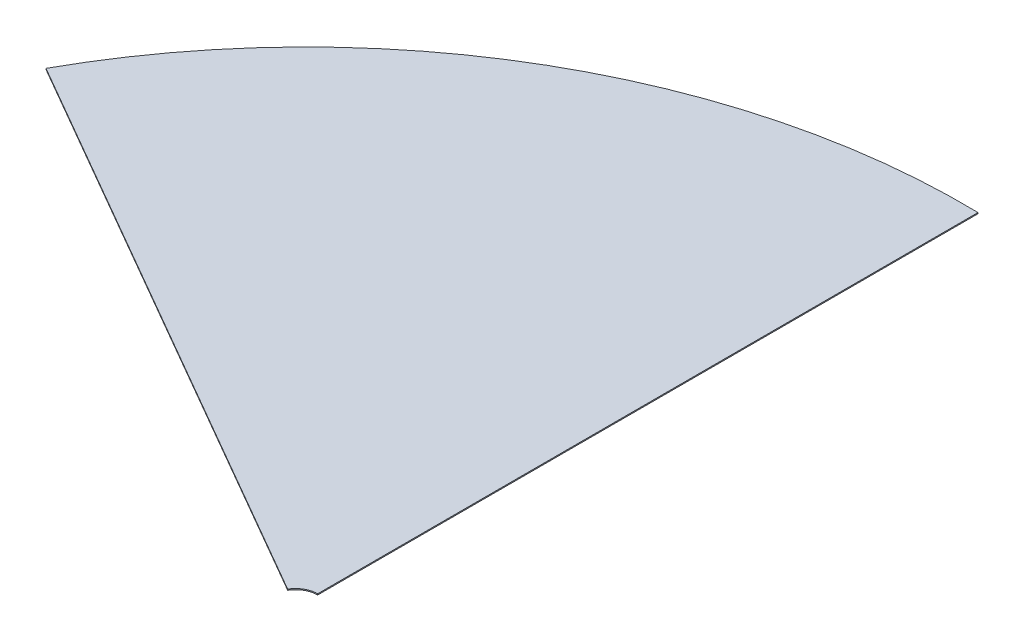
ISO-10303-21;
HEADER;
FILE_DESCRIPTION(('STEP AP214'),'2;1');
FILE_NAME('part.step','',(''),(''),'','','');
FILE_SCHEMA(('AUTOMOTIVE_DESIGN { 1 0 10303 214 1 1 1 1 }'));
ENDSEC;
DATA;
#1=APPLICATION_CONTEXT('core data for automotive mechanical design processes');
#2=APPLICATION_PROTOCOL_DEFINITION('international standard','automotive_design',2000,#1);
#3=PRODUCT_CONTEXT('',#1,'mechanical');
#4=PRODUCT('Part','Part','',(#3));
#5=PRODUCT_RELATED_PRODUCT_CATEGORY('part','',(#4));
#6=PRODUCT_DEFINITION_FORMATION('','',#4);
#7=PRODUCT_DEFINITION_CONTEXT('part definition',#1,'design');
#8=PRODUCT_DEFINITION('design','',#6,#7);
#9=PRODUCT_DEFINITION_SHAPE('','',#8);
#10=(LENGTH_UNIT() NAMED_UNIT(*) SI_UNIT(.MILLI.,.METRE.));
#11=(NAMED_UNIT(*) PLANE_ANGLE_UNIT() SI_UNIT($,.RADIAN.));
#12=(NAMED_UNIT(*) SI_UNIT($,.STERADIAN.) SOLID_ANGLE_UNIT());
#13=UNCERTAINTY_MEASURE_WITH_UNIT(LENGTH_MEASURE(1.E-05),#10,'distance_accuracy_value','');
#14=(GEOMETRIC_REPRESENTATION_CONTEXT(3) GLOBAL_UNCERTAINTY_ASSIGNED_CONTEXT((#13)) GLOBAL_UNIT_ASSIGNED_CONTEXT((#10,
#11,#12)) REPRESENTATION_CONTEXT('',''));
#15=CARTESIAN_POINT('',(0.,0.,0.));
#16=DIRECTION('',(0.,0.,1.));
#17=DIRECTION('',(1.,0.,0.));
#18=AXIS2_PLACEMENT_3D('',#15,#16,#17);
#19=CARTESIAN_POINT('',(0.,0.5,0.));
#20=DIRECTION('',(0.,-1.,0.));
#21=DIRECTION('',(0.,0.,-1.));
#22=AXIS2_PLACEMENT_3D('',#19,#20,#21);
#23=CYLINDRICAL_SURFACE('',#22,10.);
#24=CARTESIAN_POINT('',(0.,0.,0.));
#25=DIRECTION('',(0.,-1.,0.));
#26=DIRECTION('',(0.,0.,1.));
#27=AXIS2_PLACEMENT_3D('',#24,#25,#26);
#28=CIRCLE('',#27,10.);
#29=CARTESIAN_POINT('',(-8.6602540378444,0.,-4.99999999999998));
#30=VERTEX_POINT('',#29);
#31=CARTESIAN_POINT('',(0.,0.,-10.));
#32=VERTEX_POINT('',#31);
#33=EDGE_CURVE('E111',#30,#32,#28,.T.);
#34=ORIENTED_EDGE('',*,*,#33,.T.);
#35=DIRECTION('',(0.,-1.,0.));
#36=VECTOR('',#35,1.);
#37=CARTESIAN_POINT('',(0.,0.5,-10.));
#38=LINE('',#37,#36);
#39=CARTESIAN_POINT('',(0.,0.5,-10.));
#40=VERTEX_POINT('',#39);
#41=EDGE_CURVE('E11',#40,#32,#38,.T.);
#42=ORIENTED_EDGE('',*,*,#41,.F.);
#43=CARTESIAN_POINT('',(0.,0.5,0.));
#44=DIRECTION('',(0.,-1.,0.));
#45=DIRECTION('',(0.,0.,1.));
#46=AXIS2_PLACEMENT_3D('',#43,#44,#45);
#47=CIRCLE('',#46,10.);
#48=CARTESIAN_POINT('',(-8.6602540378444,0.5,-4.99999999999998));
#49=VERTEX_POINT('',#48);
#50=EDGE_CURVE('E95',#49,#40,#47,.T.);
#51=ORIENTED_EDGE('',*,*,#50,.F.);
#52=DIRECTION('',(0.,-1.,0.));
#53=VECTOR('',#52,1.);
#54=CARTESIAN_POINT('',(-8.6602540378444,0.5,-4.99999999999998));
#55=LINE('',#54,#53);
#56=EDGE_CURVE('E107',#49,#30,#55,.T.);
#57=ORIENTED_EDGE('',*,*,#56,.T.);
#58=EDGE_LOOP('',(#34,#42,#51,#57));
#59=FACE_BOUND('',#58,.T.);
#60=ADVANCED_FACE('F43',(#59),#23,.F.);
#61=CARTESIAN_POINT('',(0.,0.5,-10.));
#62=DIRECTION('',(-1.,0.,0.));
#63=DIRECTION('',(0.,0.,1.));
#64=AXIS2_PLACEMENT_3D('',#61,#62,#63);
#65=PLANE('',#64);
#66=DIRECTION('',(0.,0.,-1.));
#67=VECTOR('',#66,1.);
#68=CARTESIAN_POINT('',(0.,0.,-10.));
#69=LINE('',#68,#67);
#70=CARTESIAN_POINT('',(0.,0.,-310.47));
#71=VERTEX_POINT('',#70);
#72=EDGE_CURVE('E100',#32,#71,#69,.T.);
#73=ORIENTED_EDGE('',*,*,#72,.T.);
#74=DIRECTION('',(0.,-1.,0.));
#75=VECTOR('',#74,1.);
#76=CARTESIAN_POINT('',(0.,0.5,-310.47));
#77=LINE('',#76,#75);
#78=CARTESIAN_POINT('',(0.,0.5,-310.47));
#79=VERTEX_POINT('',#78);
#80=EDGE_CURVE('E52',#79,#71,#77,.T.);
#81=ORIENTED_EDGE('',*,*,#80,.F.);
#82=DIRECTION('',(0.,0.,-1.));
#83=VECTOR('',#82,1.);
#84=CARTESIAN_POINT('',(0.,0.5,-10.));
#85=LINE('',#84,#83);
#86=EDGE_CURVE('E90',#40,#79,#85,.T.);
#87=ORIENTED_EDGE('',*,*,#86,.F.);
#88=ORIENTED_EDGE('',*,*,#41,.T.);
#89=EDGE_LOOP('',(#73,#81,#87,#88));
#90=FACE_BOUND('',#89,.T.);
#91=ADVANCED_FACE('F99',(#90),#65,.F.);
#92=CARTESIAN_POINT('',(-6.3726801261933,0.5,-11.0378057589511));
#93=DIRECTION('',(0.,-1.,0.));
#94=DIRECTION('',(0.,0.,-1.));
#95=AXIS2_PLACEMENT_3D('',#92,#93,#94);
#96=CYLINDRICAL_SURFACE('',#95,299.5);
#97=CARTESIAN_POINT('',(-6.3726801261933,0.,-11.0378057589511));
#98=DIRECTION('',(0.,1.,0.));
#99=DIRECTION('',(0.,0.,-1.));
#100=AXIS2_PLACEMENT_3D('',#97,#98,#99);
#101=CIRCLE('',#100,299.5);
#102=CARTESIAN_POINT('',(-268.874907112955,0.,-155.234999999999));
#103=VERTEX_POINT('',#102);
#104=EDGE_CURVE('E77',#71,#103,#101,.T.);
#105=ORIENTED_EDGE('',*,*,#104,.T.);
#106=DIRECTION('',(0.,-1.,0.));
#107=VECTOR('',#106,1.);
#108=CARTESIAN_POINT('',(-268.874907112955,0.5,-155.234999999999));
#109=LINE('',#108,#107);
#110=CARTESIAN_POINT('',(-268.874907112955,0.5,-155.234999999999));
#111=VERTEX_POINT('',#110);
#112=EDGE_CURVE('E102',#111,#103,#109,.T.);
#113=ORIENTED_EDGE('',*,*,#112,.F.);
#114=CARTESIAN_POINT('',(-6.3726801261933,0.5,-11.0378057589511));
#115=DIRECTION('',(0.,1.,0.));
#116=DIRECTION('',(0.,0.,-1.));
#117=AXIS2_PLACEMENT_3D('',#114,#115,#116);
#118=CIRCLE('',#117,299.5);
#119=EDGE_CURVE('E93',#79,#111,#118,.T.);
#120=ORIENTED_EDGE('',*,*,#119,.F.);
#121=ORIENTED_EDGE('',*,*,#80,.T.);
#122=EDGE_LOOP('',(#105,#113,#120,#121));
#123=FACE_BOUND('',#122,.T.);
#124=ADVANCED_FACE('F103',(#123),#96,.T.);
#125=CARTESIAN_POINT('',(-8.6602540378444,0.5,-4.99999999999998));
#126=DIRECTION('',(0.499999999999998,0.,-0.86602540378444));
#127=DIRECTION('',(-0.86602540378444,0.,-0.499999999999998));
#128=AXIS2_PLACEMENT_3D('',#125,#126,#127);
#129=PLANE('',#128);
#130=DIRECTION('',(0.86602540378444,0.,0.499999999999998));
#131=VECTOR('',#130,1.);
#132=CARTESIAN_POINT('',(-8.6602540378444,0.,-4.99999999999998));
#133=LINE('',#132,#131);
#134=EDGE_CURVE('E83',#103,#30,#133,.T.);
#135=ORIENTED_EDGE('',*,*,#134,.T.);
#136=ORIENTED_EDGE('',*,*,#56,.F.);
#137=DIRECTION('',(0.86602540378444,0.,0.499999999999998));
#138=VECTOR('',#137,1.);
#139=CARTESIAN_POINT('',(-8.6602540378444,0.5,-4.99999999999998));
#140=LINE('',#139,#138);
#141=EDGE_CURVE('E60',#111,#49,#140,.T.);
#142=ORIENTED_EDGE('',*,*,#141,.F.);
#143=ORIENTED_EDGE('',*,*,#112,.T.);
#144=EDGE_LOOP('',(#135,#136,#142,#143));
#145=FACE_BOUND('',#144,.T.);
#146=ADVANCED_FACE('F124',(#145),#129,.F.);
#147=CARTESIAN_POINT('',(0.,0.5,0.));
#148=DIRECTION('',(0.,1.,0.));
#149=DIRECTION('',(0.,0.,1.));
#150=AXIS2_PLACEMENT_3D('',#147,#148,#149);
#151=PLANE('',#150);
#152=ORIENTED_EDGE('',*,*,#50,.T.);
#153=ORIENTED_EDGE('',*,*,#86,.T.);
#154=ORIENTED_EDGE('',*,*,#119,.T.);
#155=ORIENTED_EDGE('',*,*,#141,.T.);
#156=EDGE_LOOP('',(#152,#153,#154,#155));
#157=FACE_BOUND('',#156,.T.);
#158=ADVANCED_FACE('F91',(#157),#151,.T.);
#159=CARTESIAN_POINT('',(0.,0.,0.));
#160=DIRECTION('',(0.,1.,0.));
#161=DIRECTION('',(0.,0.,1.));
#162=AXIS2_PLACEMENT_3D('',#159,#160,#161);
#163=PLANE('',#162);
#164=ORIENTED_EDGE('',*,*,#33,.F.);
#165=ORIENTED_EDGE('',*,*,#134,.F.);
#166=ORIENTED_EDGE('',*,*,#104,.F.);
#167=ORIENTED_EDGE('',*,*,#72,.F.);
#168=EDGE_LOOP('',(#164,#165,#166,#167));
#169=FACE_BOUND('',#168,.T.);
#170=ADVANCED_FACE('F127',(#169),#163,.F.);
#171=CLOSED_SHELL('',(#60,#91,#124,#146,#158,#170));
#172=MANIFOLD_SOLID_BREP('B2',#171);
#173=ADVANCED_BREP_SHAPE_REPRESENTATION('',(#18,#172),#14);
#174=SHAPE_DEFINITION_REPRESENTATION(#9,#173);
ENDSEC;
END-ISO-10303-21;
